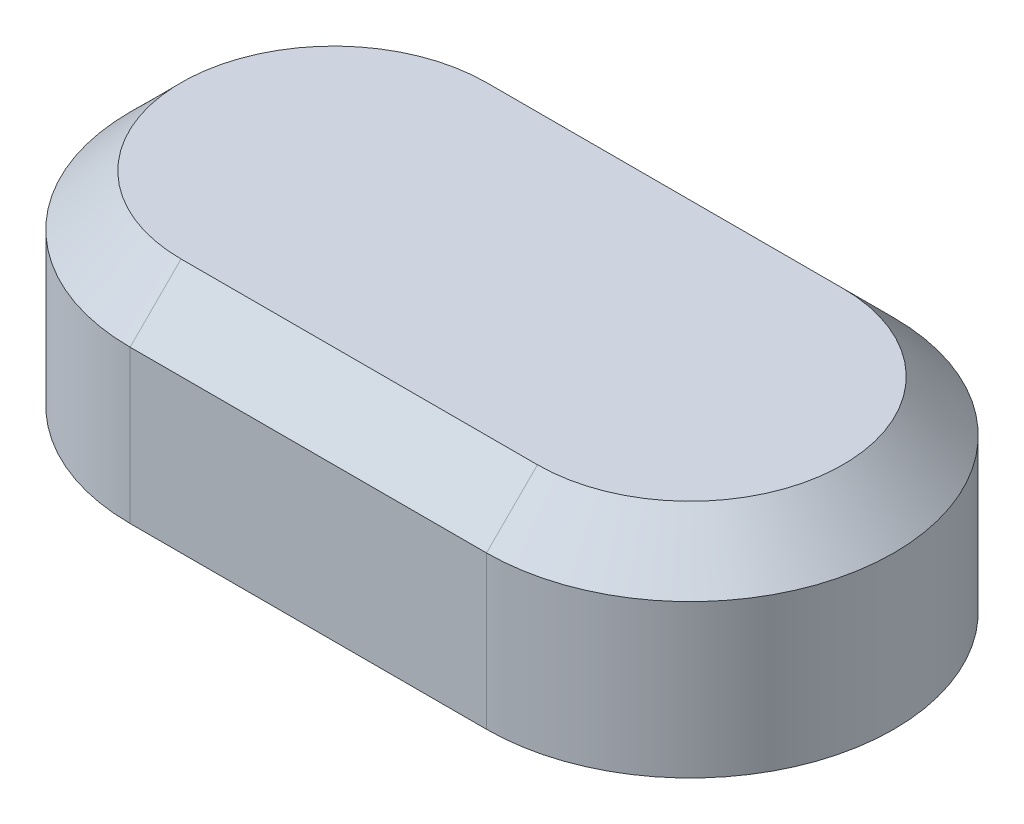
ISO-10303-21;
HEADER;
FILE_DESCRIPTION(('STEP AP214'),'2;1');
FILE_NAME('part.step','',(''),(''),'','','');
FILE_SCHEMA(('AUTOMOTIVE_DESIGN { 1 0 10303 214 1 1 1 1 }'));
ENDSEC;
DATA;
#1=APPLICATION_CONTEXT('core data for automotive mechanical design processes');
#2=APPLICATION_PROTOCOL_DEFINITION('international standard','automotive_design',2000,#1);
#3=PRODUCT_CONTEXT('',#1,'mechanical');
#4=PRODUCT('Part','Part','',(#3));
#5=PRODUCT_RELATED_PRODUCT_CATEGORY('part','',(#4));
#6=PRODUCT_DEFINITION_FORMATION('','',#4);
#7=PRODUCT_DEFINITION_CONTEXT('part definition',#1,'design');
#8=PRODUCT_DEFINITION('design','',#6,#7);
#9=PRODUCT_DEFINITION_SHAPE('','',#8);
#10=(LENGTH_UNIT() NAMED_UNIT(*) SI_UNIT(.MILLI.,.METRE.));
#11=(NAMED_UNIT(*) PLANE_ANGLE_UNIT() SI_UNIT($,.RADIAN.));
#12=(NAMED_UNIT(*) SI_UNIT($,.STERADIAN.) SOLID_ANGLE_UNIT());
#13=UNCERTAINTY_MEASURE_WITH_UNIT(LENGTH_MEASURE(1.E-05),#10,'distance_accuracy_value','');
#14=(GEOMETRIC_REPRESENTATION_CONTEXT(3) GLOBAL_UNCERTAINTY_ASSIGNED_CONTEXT((#13)) GLOBAL_UNIT_ASSIGNED_CONTEXT((#10,
#11,#12)) REPRESENTATION_CONTEXT('',''));
#15=CARTESIAN_POINT('',(0.,0.,0.));
#16=DIRECTION('',(0.,0.,1.));
#17=DIRECTION('',(1.,0.,0.));
#18=AXIS2_PLACEMENT_3D('',#15,#16,#17);
#19=CARTESIAN_POINT('',(-3.50000000000001,4.,0.));
#20=DIRECTION('',(0.,-1.,0.));
#21=DIRECTION('',(0.,0.,-1.));
#22=AXIS2_PLACEMENT_3D('',#19,#20,#21);
#23=CYLINDRICAL_SURFACE('',#22,4.);
#24=DIRECTION('',(0.,-1.,0.));
#25=VECTOR('',#24,1.);
#26=CARTESIAN_POINT('',(-3.50000000000001,4.,4.));
#27=LINE('',#26,#25);
#28=CARTESIAN_POINT('',(-3.50000000000001,3.,4.));
#29=VERTEX_POINT('',#28);
#30=CARTESIAN_POINT('',(-3.50000000000001,0.,4.));
#31=VERTEX_POINT('',#30);
#32=EDGE_CURVE('E101',#29,#31,#27,.T.);
#33=ORIENTED_EDGE('',*,*,#32,.F.);
#34=CARTESIAN_POINT('',(-3.50000000000001,3.,0.));
#35=DIRECTION('',(0.,1.,0.));
#36=DIRECTION('',(0.,0.,1.));
#37=AXIS2_PLACEMENT_3D('',#34,#35,#36);
#38=CIRCLE('',#37,4.);
#39=CARTESIAN_POINT('',(-3.50000000000001,3.,-4.));
#40=VERTEX_POINT('',#39);
#41=EDGE_CURVE('E156',#29,#40,#38,.F.);
#42=ORIENTED_EDGE('',*,*,#41,.T.);
#43=DIRECTION('',(0.,-1.,0.));
#44=VECTOR('',#43,1.);
#45=CARTESIAN_POINT('',(-3.50000000000001,4.,-4.));
#46=LINE('',#45,#44);
#47=CARTESIAN_POINT('',(-3.50000000000001,0.,-4.));
#48=VERTEX_POINT('',#47);
#49=EDGE_CURVE('E124',#40,#48,#46,.T.);
#50=ORIENTED_EDGE('',*,*,#49,.T.);
#51=CARTESIAN_POINT('',(-3.50000000000001,0.,0.));
#52=DIRECTION('',(0.,1.,0.));
#53=DIRECTION('',(0.,0.,1.));
#54=AXIS2_PLACEMENT_3D('',#51,#52,#53);
#55=CIRCLE('',#54,4.);
#56=EDGE_CURVE('E119',#48,#31,#55,.T.);
#57=ORIENTED_EDGE('',*,*,#56,.T.);
#58=EDGE_LOOP('',(#33,#42,#50,#57));
#59=FACE_BOUND('',#58,.T.);
#60=ADVANCED_FACE('F45',(#59),#23,.T.);
#61=CARTESIAN_POINT('',(-3.50000000000001,4.,4.));
#62=DIRECTION('',(0.,0.,-1.));
#63=DIRECTION('',(-1.,0.,0.));
#64=AXIS2_PLACEMENT_3D('',#61,#62,#63);
#65=PLANE('',#64);
#66=DIRECTION('',(0.,-1.,0.));
#67=VECTOR('',#66,1.);
#68=CARTESIAN_POINT('',(3.50000000000001,4.,4.));
#69=LINE('',#68,#67);
#70=CARTESIAN_POINT('',(3.50000000000001,3.,4.));
#71=VERTEX_POINT('',#70);
#72=CARTESIAN_POINT('',(3.50000000000001,0.,4.));
#73=VERTEX_POINT('',#72);
#74=EDGE_CURVE('E113',#71,#73,#69,.T.);
#75=ORIENTED_EDGE('',*,*,#74,.F.);
#76=DIRECTION('',(-1.,0.,0.));
#77=VECTOR('',#76,1.);
#78=CARTESIAN_POINT('',(-3.50000000000001,3.,4.));
#79=LINE('',#78,#77);
#80=EDGE_CURVE('E11',#71,#29,#79,.T.);
#81=ORIENTED_EDGE('',*,*,#80,.T.);
#82=ORIENTED_EDGE('',*,*,#32,.T.);
#83=DIRECTION('',(1.,0.,0.));
#84=VECTOR('',#83,1.);
#85=CARTESIAN_POINT('',(-3.50000000000001,0.,4.));
#86=LINE('',#85,#84);
#87=EDGE_CURVE('E104',#31,#73,#86,.T.);
#88=ORIENTED_EDGE('',*,*,#87,.T.);
#89=EDGE_LOOP('',(#75,#81,#82,#88));
#90=FACE_BOUND('',#89,.T.);
#91=ADVANCED_FACE('F103',(#90),#65,.F.);
#92=CARTESIAN_POINT('',(3.50000000000001,4.,0.));
#93=DIRECTION('',(0.,-1.,0.));
#94=DIRECTION('',(0.,0.,-1.));
#95=AXIS2_PLACEMENT_3D('',#92,#93,#94);
#96=CYLINDRICAL_SURFACE('',#95,4.);
#97=DIRECTION('',(0.,-1.,0.));
#98=VECTOR('',#97,1.);
#99=CARTESIAN_POINT('',(3.50000000000001,4.,-4.));
#100=LINE('',#99,#98);
#101=CARTESIAN_POINT('',(3.50000000000001,3.,-4.));
#102=VERTEX_POINT('',#101);
#103=CARTESIAN_POINT('',(3.50000000000001,0.,-4.));
#104=VERTEX_POINT('',#103);
#105=EDGE_CURVE('E139',#102,#104,#100,.T.);
#106=ORIENTED_EDGE('',*,*,#105,.F.);
#107=CARTESIAN_POINT('',(3.50000000000001,3.,0.));
#108=DIRECTION('',(0.,1.,0.));
#109=DIRECTION('',(0.,0.,1.));
#110=AXIS2_PLACEMENT_3D('',#107,#108,#109);
#111=CIRCLE('',#110,4.);
#112=EDGE_CURVE('E56',#102,#71,#111,.F.);
#113=ORIENTED_EDGE('',*,*,#112,.T.);
#114=ORIENTED_EDGE('',*,*,#74,.T.);
#115=CARTESIAN_POINT('',(3.50000000000001,0.,0.));
#116=DIRECTION('',(0.,1.,0.));
#117=DIRECTION('',(0.,0.,1.));
#118=AXIS2_PLACEMENT_3D('',#115,#116,#117);
#119=CIRCLE('',#118,4.);
#120=EDGE_CURVE('E121',#73,#104,#119,.T.);
#121=ORIENTED_EDGE('',*,*,#120,.T.);
#122=EDGE_LOOP('',(#106,#113,#114,#121));
#123=FACE_BOUND('',#122,.T.);
#124=ADVANCED_FACE('F186',(#123),#96,.T.);
#125=CARTESIAN_POINT('',(-3.50000000000001,4.,-4.));
#126=DIRECTION('',(0.,0.,1.));
#127=DIRECTION('',(1.,0.,0.));
#128=AXIS2_PLACEMENT_3D('',#125,#126,#127);
#129=PLANE('',#128);
#130=ORIENTED_EDGE('',*,*,#49,.F.);
#131=DIRECTION('',(1.,0.,0.));
#132=VECTOR('',#131,1.);
#133=CARTESIAN_POINT('',(3.50000000000001,3.,-4.));
#134=LINE('',#133,#132);
#135=EDGE_CURVE('E71',#40,#102,#134,.T.);
#136=ORIENTED_EDGE('',*,*,#135,.T.);
#137=ORIENTED_EDGE('',*,*,#105,.T.);
#138=DIRECTION('',(-1.,0.,0.));
#139=VECTOR('',#138,1.);
#140=CARTESIAN_POINT('',(-3.50000000000001,0.,-4.));
#141=LINE('',#140,#139);
#142=EDGE_CURVE('E134',#104,#48,#141,.T.);
#143=ORIENTED_EDGE('',*,*,#142,.T.);
#144=EDGE_LOOP('',(#130,#136,#137,#143));
#145=FACE_BOUND('',#144,.T.);
#146=ADVANCED_FACE('F185',(#145),#129,.F.);
#147=CARTESIAN_POINT('',(-3.50000000000001,4.,0.));
#148=DIRECTION('',(0.,1.,0.));
#149=DIRECTION('',(0.,0.,1.));
#150=AXIS2_PLACEMENT_3D('',#147,#148,#149);
#151=PLANE('',#150);
#152=DIRECTION('',(-1.,0.,0.));
#153=VECTOR('',#152,1.);
#154=CARTESIAN_POINT('',(-3.50000000000001,4.,-3.));
#155=LINE('',#154,#153);
#156=CARTESIAN_POINT('',(3.50000000000001,4.,-3.));
#157=VERTEX_POINT('',#156);
#158=CARTESIAN_POINT('',(-3.50000000000001,4.,-3.));
#159=VERTEX_POINT('',#158);
#160=EDGE_CURVE('E149',#157,#159,#155,.T.);
#161=ORIENTED_EDGE('',*,*,#160,.T.);
#162=CARTESIAN_POINT('',(-3.50000000000001,4.,0.));
#163=DIRECTION('',(0.,1.,0.));
#164=DIRECTION('',(0.,0.,1.));
#165=AXIS2_PLACEMENT_3D('',#162,#163,#164);
#166=CIRCLE('',#165,3.);
#167=CARTESIAN_POINT('',(-3.50000000000001,4.,3.));
#168=VERTEX_POINT('',#167);
#169=EDGE_CURVE('E152',#159,#168,#166,.T.);
#170=ORIENTED_EDGE('',*,*,#169,.T.);
#171=DIRECTION('',(1.,0.,0.));
#172=VECTOR('',#171,1.);
#173=CARTESIAN_POINT('',(3.50000000000001,4.,3.));
#174=LINE('',#173,#172);
#175=CARTESIAN_POINT('',(3.50000000000001,4.,3.));
#176=VERTEX_POINT('',#175);
#177=EDGE_CURVE('E112',#168,#176,#174,.T.);
#178=ORIENTED_EDGE('',*,*,#177,.T.);
#179=CARTESIAN_POINT('',(3.50000000000001,4.,0.));
#180=DIRECTION('',(0.,1.,0.));
#181=DIRECTION('',(0.,0.,1.));
#182=AXIS2_PLACEMENT_3D('',#179,#180,#181);
#183=CIRCLE('',#182,3.);
#184=EDGE_CURVE('E146',#176,#157,#183,.T.);
#185=ORIENTED_EDGE('',*,*,#184,.T.);
#186=EDGE_LOOP('',(#161,#170,#178,#185));
#187=FACE_BOUND('',#186,.T.);
#188=ADVANCED_FACE('F180',(#187),#151,.T.);
#189=CARTESIAN_POINT('',(-3.50000000000001,0.,0.));
#190=DIRECTION('',(0.,1.,0.));
#191=DIRECTION('',(0.,0.,1.));
#192=AXIS2_PLACEMENT_3D('',#189,#190,#191);
#193=PLANE('',#192);
#194=ORIENTED_EDGE('',*,*,#56,.F.);
#195=ORIENTED_EDGE('',*,*,#142,.F.);
#196=ORIENTED_EDGE('',*,*,#120,.F.);
#197=ORIENTED_EDGE('',*,*,#87,.F.);
#198=EDGE_LOOP('',(#194,#195,#196,#197));
#199=FACE_BOUND('',#198,.T.);
#200=ADVANCED_FACE('F117',(#199),#193,.F.);
#201=CARTESIAN_POINT('',(3.50000000000001,4.,0.));
#202=DIRECTION('',(0.,-1.,0.));
#203=DIRECTION('',(0.,0.,-1.));
#204=AXIS2_PLACEMENT_3D('',#201,#202,#203);
#205=CONICAL_SURFACE('',#204,3.,0.785398163397447);
#206=DIRECTION('',(0.,0.707106781186549,-0.707106781186546));
#207=VECTOR('',#206,1.);
#208=CARTESIAN_POINT('',(3.50000000000001,3.,4.));
#209=LINE('',#208,#207);
#210=EDGE_CURVE('E130',#71,#176,#209,.T.);
#211=ORIENTED_EDGE('',*,*,#210,.F.);
#212=ORIENTED_EDGE('',*,*,#112,.F.);
#213=DIRECTION('',(0.,-0.707106781186548,-0.707106781186546));
#214=VECTOR('',#213,1.);
#215=CARTESIAN_POINT('',(3.50000000000001,4.,-3.));
#216=LINE('',#215,#214);
#217=EDGE_CURVE('E50',#157,#102,#216,.T.);
#218=ORIENTED_EDGE('',*,*,#217,.F.);
#219=ORIENTED_EDGE('',*,*,#184,.F.);
#220=EDGE_LOOP('',(#211,#212,#218,#219));
#221=FACE_BOUND('',#220,.T.);
#222=ADVANCED_FACE('F48',(#221),#205,.T.);
#223=CARTESIAN_POINT('',(-3.50000000000001,4.,-3.));
#224=DIRECTION('',(0.,0.707106781186546,-0.707106781186549));
#225=DIRECTION('',(1.,0.,0.));
#226=AXIS2_PLACEMENT_3D('',#223,#224,#225);
#227=PLANE('',#226);
#228=ORIENTED_EDGE('',*,*,#217,.T.);
#229=ORIENTED_EDGE('',*,*,#135,.F.);
#230=DIRECTION('',(0.,-0.707106781186549,-0.707106781186546));
#231=VECTOR('',#230,1.);
#232=CARTESIAN_POINT('',(-3.50000000000001,4.,-3.));
#233=LINE('',#232,#231);
#234=EDGE_CURVE('E166',#159,#40,#233,.T.);
#235=ORIENTED_EDGE('',*,*,#234,.F.);
#236=ORIENTED_EDGE('',*,*,#160,.F.);
#237=EDGE_LOOP('',(#228,#229,#235,#236));
#238=FACE_BOUND('',#237,.T.);
#239=ADVANCED_FACE('F210',(#238),#227,.T.);
#240=CARTESIAN_POINT('',(-3.50000000000001,4.,3.));
#241=DIRECTION('',(0.,0.707106781186546,0.707106781186549));
#242=DIRECTION('',(-1.,0.,0.));
#243=AXIS2_PLACEMENT_3D('',#240,#241,#242);
#244=PLANE('',#243);
#245=ORIENTED_EDGE('',*,*,#210,.T.);
#246=ORIENTED_EDGE('',*,*,#177,.F.);
#247=DIRECTION('',(0.,0.707106781186549,-0.707106781186546));
#248=VECTOR('',#247,1.);
#249=CARTESIAN_POINT('',(-3.50000000000001,3.,4.));
#250=LINE('',#249,#248);
#251=EDGE_CURVE('E163',#29,#168,#250,.T.);
#252=ORIENTED_EDGE('',*,*,#251,.F.);
#253=ORIENTED_EDGE('',*,*,#80,.F.);
#254=EDGE_LOOP('',(#245,#246,#252,#253));
#255=FACE_BOUND('',#254,.T.);
#256=ADVANCED_FACE('F173',(#255),#244,.T.);
#257=CARTESIAN_POINT('',(-3.50000000000001,4.,0.));
#258=DIRECTION('',(0.,-1.,0.));
#259=DIRECTION('',(0.,0.,-1.));
#260=AXIS2_PLACEMENT_3D('',#257,#258,#259);
#261=CONICAL_SURFACE('',#260,3.,0.785398163397447);
#262=ORIENTED_EDGE('',*,*,#234,.T.);
#263=ORIENTED_EDGE('',*,*,#41,.F.);
#264=ORIENTED_EDGE('',*,*,#251,.T.);
#265=ORIENTED_EDGE('',*,*,#169,.F.);
#266=EDGE_LOOP('',(#262,#263,#264,#265));
#267=FACE_BOUND('',#266,.T.);
#268=ADVANCED_FACE('F184',(#267),#261,.T.);
#269=CLOSED_SHELL('',(#60,#91,#124,#146,#188,#200,#222,#239,#256,#268));
#270=MANIFOLD_SOLID_BREP('B2',#269);
#271=ADVANCED_BREP_SHAPE_REPRESENTATION('',(#18,#270),#14);
#272=SHAPE_DEFINITION_REPRESENTATION(#9,#271);
ENDSEC;
END-ISO-10303-21;
